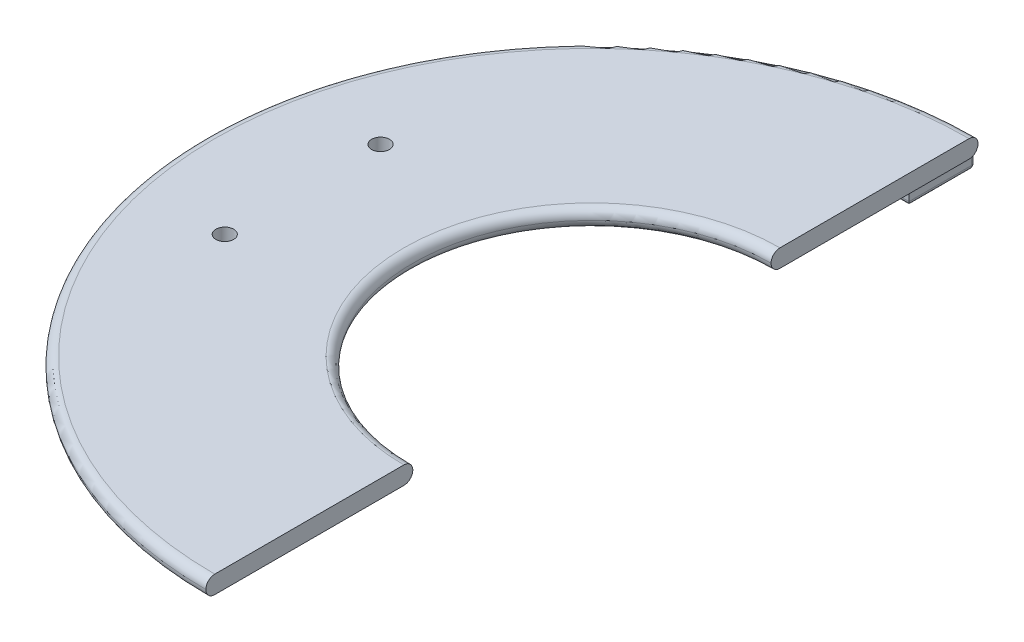
ISO-10303-21;
HEADER;
FILE_DESCRIPTION(('STEP AP214'),'2;1');
FILE_NAME('part.step','',(''),(''),'','','');
FILE_SCHEMA(('AUTOMOTIVE_DESIGN { 1 0 10303 214 1 1 1 1 }'));
ENDSEC;
DATA;
#1=APPLICATION_CONTEXT('core data for automotive mechanical design processes');
#2=APPLICATION_PROTOCOL_DEFINITION('international standard','automotive_design',2000,#1);
#3=PRODUCT_CONTEXT('',#1,'mechanical');
#4=PRODUCT('Part','Part','',(#3));
#5=PRODUCT_RELATED_PRODUCT_CATEGORY('part','',(#4));
#6=PRODUCT_DEFINITION_FORMATION('','',#4);
#7=PRODUCT_DEFINITION_CONTEXT('part definition',#1,'design');
#8=PRODUCT_DEFINITION('design','',#6,#7);
#9=PRODUCT_DEFINITION_SHAPE('','',#8);
#10=(LENGTH_UNIT() NAMED_UNIT(*) SI_UNIT(.MILLI.,.METRE.));
#11=(NAMED_UNIT(*) PLANE_ANGLE_UNIT() SI_UNIT($,.RADIAN.));
#12=(NAMED_UNIT(*) SI_UNIT($,.STERADIAN.) SOLID_ANGLE_UNIT());
#13=UNCERTAINTY_MEASURE_WITH_UNIT(LENGTH_MEASURE(1.E-05),#10,'distance_accuracy_value','');
#14=(GEOMETRIC_REPRESENTATION_CONTEXT(3) GLOBAL_UNCERTAINTY_ASSIGNED_CONTEXT((#13)) GLOBAL_UNIT_ASSIGNED_CONTEXT((#10,
#11,#12)) REPRESENTATION_CONTEXT('',''));
#15=CARTESIAN_POINT('',(0.,0.,0.));
#16=DIRECTION('',(0.,0.,1.));
#17=DIRECTION('',(1.,0.,0.));
#18=AXIS2_PLACEMENT_3D('',#15,#16,#17);
#19=CARTESIAN_POINT('',(-2.49999999999998,-5.,-83.75));
#20=DIRECTION('',(0.,0.,1.));
#21=DIRECTION('',(1.,0.,0.));
#22=AXIS2_PLACEMENT_3D('',#19,#20,#21);
#23=PLANE('',#22);
#24=DIRECTION('',(1.,0.,0.));
#25=VECTOR('',#24,1.);
#26=CARTESIAN_POINT('',(-2.49999999999998,-1.5,-83.75));
#27=LINE('',#26,#25);
#28=CARTESIAN_POINT('',(-13.5,-1.5,-83.75));
#29=VERTEX_POINT('',#28);
#30=CARTESIAN_POINT('',(-3.49999999999998,-1.5,-83.75));
#31=VERTEX_POINT('',#30);
#32=EDGE_CURVE('E190',#29,#31,#27,.T.);
#33=ORIENTED_EDGE('',*,*,#32,.F.);
#34=CARTESIAN_POINT('',(-13.5,-2.5,-83.75));
#35=DIRECTION('',(0.,0.,1.));
#36=DIRECTION('',(1.,0.,0.));
#37=AXIS2_PLACEMENT_3D('',#34,#35,#36);
#38=CIRCLE('',#37,1.);
#39=CARTESIAN_POINT('',(-14.5,-2.5,-83.75));
#40=VERTEX_POINT('',#39);
#41=EDGE_CURVE('E257',#29,#40,#38,.T.);
#42=ORIENTED_EDGE('',*,*,#41,.T.);
#43=DIRECTION('',(0.,1.,0.));
#44=VECTOR('',#43,1.);
#45=CARTESIAN_POINT('',(-14.5,-5.,-83.75));
#46=LINE('',#45,#44);
#47=CARTESIAN_POINT('',(-14.5,0.0151811792350656,-83.75));
#48=VERTEX_POINT('',#47);
#49=EDGE_CURVE('E51',#40,#48,#46,.T.);
#50=ORIENTED_EDGE('',*,*,#49,.T.);
#51=CARTESIAN_POINT('',(-14.5,0.0151811792350658,-83.75));
#52=CARTESIAN_POINT('',(-14.3734136057044,0.0125058415645204,-83.75));
#53=CARTESIAN_POINT('',(-14.2468193154843,0.0102207883173051,-83.75));
#54=CARTESIAN_POINT('',(-13.9936232179031,0.00637405451035215,-83.75));
#55=CARTESIAN_POINT('',(-13.8670214108496,0.00481235380186295,-83.75));
#56=CARTESIAN_POINT('',(-13.6138120039972,0.0023549911208954,-83.75));
#57=CARTESIAN_POINT('',(-13.4872044042234,0.00145932650392246,-83.75));
#58=CARTESIAN_POINT('',(-13.2339827813439,0.000282067447967724,-83.75));
#59=CARTESIAN_POINT('',(-13.1073687581576,4.90112956266747E-07,-83.75));
#60=CARTESIAN_POINT('',(-12.9807549857472,0.,-83.75));
#61=B_SPLINE_CURVE_WITH_KNOTS('',3,(#51,#52,#53,#54,#55,#56,#57,#58,#59,#60),.UNSPECIFIED.,.F.,
.F.,(4,2,2,2,4),(0.,0.379842878170045,0.759675175302849,1.13950596430443,1.51934733247249),.UNSPECIFIED.);
#62=CARTESIAN_POINT('',(-12.9807549857472,0.,-83.75));
#63=VERTEX_POINT('',#62);
#64=EDGE_CURVE('E11',#48,#63,#61,.T.);
#65=ORIENTED_EDGE('',*,*,#64,.T.);
#66=DIRECTION('',(1.,0.,0.));
#67=VECTOR('',#66,1.);
#68=CARTESIAN_POINT('',(-2.49999999999998,0.,-83.75));
#69=LINE('',#68,#67);
#70=CARTESIAN_POINT('',(-2.49999999999998,0.,-83.75));
#71=VERTEX_POINT('',#70);
#72=EDGE_CURVE('E165',#63,#71,#69,.T.);
#73=ORIENTED_EDGE('',*,*,#72,.T.);
#74=DIRECTION('',(0.,1.,0.));
#75=VECTOR('',#74,1.);
#76=CARTESIAN_POINT('',(-2.49999999999998,-5.,-83.75));
#77=LINE('',#76,#75);
#78=CARTESIAN_POINT('',(-2.49999999999998,-2.5,-83.75));
#79=VERTEX_POINT('',#78);
#80=EDGE_CURVE('E168',#79,#71,#77,.T.);
#81=ORIENTED_EDGE('',*,*,#80,.F.);
#82=CARTESIAN_POINT('',(-3.49999999999998,-2.5,-83.75));
#83=DIRECTION('',(0.,0.,1.));
#84=DIRECTION('',(1.,0.,0.));
#85=AXIS2_PLACEMENT_3D('',#82,#83,#84);
#86=CIRCLE('',#85,1.);
#87=EDGE_CURVE('E255',#79,#31,#86,.T.);
#88=ORIENTED_EDGE('',*,*,#87,.T.);
#89=EDGE_LOOP('',(#33,#42,#50,#65,#73,#81,#88));
#90=FACE_BOUND('',#89,.T.);
#91=ADVANCED_FACE('F35',(#90),#23,.F.);
#92=CARTESIAN_POINT('',(0.,0.,0.));
#93=DIRECTION('',(0.,1.,0.));
#94=DIRECTION('',(0.,0.,1.));
#95=AXIS2_PLACEMENT_3D('',#92,#93,#94);
#96=PLANE('',#95);
#97=CARTESIAN_POINT('',(-65.,0.,17.5));
#98=DIRECTION('',(0.,1.,0.));
#99=DIRECTION('',(0.,0.,1.));
#100=AXIS2_PLACEMENT_3D('',#97,#98,#99);
#101=CIRCLE('',#100,2.);
#102=CARTESIAN_POINT('',(-65.,0.,19.5));
#103=VERTEX_POINT('',#102);
#104=EDGE_CURVE('E39',#103,#103,#101,.T.);
#105=ORIENTED_EDGE('',*,*,#104,.T.);
#106=EDGE_LOOP('',(#105));
#107=FACE_BOUND('',#106,.T.);
#108=CARTESIAN_POINT('',(-65.,0.,-17.5));
#109=DIRECTION('',(0.,1.,0.));
#110=DIRECTION('',(0.,0.,1.));
#111=AXIS2_PLACEMENT_3D('',#108,#109,#110);
#112=CIRCLE('',#111,2.);
#113=CARTESIAN_POINT('',(-65.,0.,-15.5));
#114=VERTEX_POINT('',#113);
#115=EDGE_CURVE('E462',#114,#114,#112,.T.);
#116=ORIENTED_EDGE('',*,*,#115,.T.);
#117=EDGE_LOOP('',(#116));
#118=FACE_BOUND('',#117,.T.);
#119=DIRECTION('',(0.,0.,-1.));
#120=VECTOR('',#119,1.);
#121=CARTESIAN_POINT('',(0.,0.,-86.75));
#122=LINE('',#121,#120);
#123=CARTESIAN_POINT('',(0.,0.,-42.25));
#124=VERTEX_POINT('',#123);
#125=CARTESIAN_POINT('',(0.,0.,-84.75));
#126=VERTEX_POINT('',#125);
#127=EDGE_CURVE('E205',#124,#126,#122,.T.);
#128=ORIENTED_EDGE('',*,*,#127,.F.);
#129=CARTESIAN_POINT('',(0.,0.,0.));
#130=DIRECTION('',(0.,1.,0.));
#131=DIRECTION('',(0.,0.,1.));
#132=AXIS2_PLACEMENT_3D('',#129,#130,#131);
#133=CIRCLE('',#132,42.25);
#134=CARTESIAN_POINT('',(0.,0.,42.25));
#135=VERTEX_POINT('',#134);
#136=EDGE_CURVE('E323',#124,#135,#133,.T.);
#137=ORIENTED_EDGE('',*,*,#136,.T.);
#138=DIRECTION('',(0.,0.,-1.));
#139=VECTOR('',#138,1.);
#140=CARTESIAN_POINT('',(0.,0.,40.25));
#141=LINE('',#140,#139);
#142=CARTESIAN_POINT('',(0.,0.,84.75));
#143=VERTEX_POINT('',#142);
#144=EDGE_CURVE('E210',#143,#135,#141,.T.);
#145=ORIENTED_EDGE('',*,*,#144,.F.);
#146=CARTESIAN_POINT('',(0.,0.,0.));
#147=DIRECTION('',(0.,1.,0.));
#148=DIRECTION('',(0.,0.,1.));
#149=AXIS2_PLACEMENT_3D('',#146,#147,#148);
#150=CIRCLE('',#149,84.75);
#151=CARTESIAN_POINT('',(-14.5,0.,-83.5003742506583));
#152=VERTEX_POINT('',#151);
#153=EDGE_CURVE('E321',#143,#152,#150,.F.);
#154=ORIENTED_EDGE('',*,*,#153,.T.);
#155=DIRECTION('',(0.,0.,-1.));
#156=VECTOR('',#155,1.);
#157=CARTESIAN_POINT('',(-14.5,0.,-83.75));
#158=LINE('',#157,#156);
#159=CARTESIAN_POINT('',(-14.5,0.,-73.75));
#160=VERTEX_POINT('',#159);
#161=EDGE_CURVE('E173',#160,#152,#158,.T.);
#162=ORIENTED_EDGE('',*,*,#161,.F.);
#163=DIRECTION('',(-1.,0.,0.));
#164=VECTOR('',#163,1.);
#165=CARTESIAN_POINT('',(-2.49999999999999,0.,-73.75));
#166=LINE('',#165,#164);
#167=CARTESIAN_POINT('',(-2.49999999999999,0.,-73.75));
#168=VERTEX_POINT('',#167);
#169=EDGE_CURVE('E189',#168,#160,#166,.T.);
#170=ORIENTED_EDGE('',*,*,#169,.F.);
#171=DIRECTION('',(0.,0.,1.));
#172=VECTOR('',#171,1.);
#173=CARTESIAN_POINT('',(-2.49999999999998,0.,-83.75));
#174=LINE('',#173,#172);
#175=EDGE_CURVE('E179',#71,#168,#174,.T.);
#176=ORIENTED_EDGE('',*,*,#175,.F.);
#177=ORIENTED_EDGE('',*,*,#72,.F.);
#178=CARTESIAN_POINT('',(0.,0.,0.));
#179=DIRECTION('',(0.,1.,0.));
#180=DIRECTION('',(0.,0.,1.));
#181=AXIS2_PLACEMENT_3D('',#178,#179,#180);
#182=CIRCLE('',#181,84.75);
#183=EDGE_CURVE('E319',#63,#126,#182,.F.);
#184=ORIENTED_EDGE('',*,*,#183,.T.);
#185=EDGE_LOOP('',(#128,#137,#145,#154,#162,#170,#176,#177,#184));
#186=FACE_BOUND('',#185,.T.);
#187=ADVANCED_FACE('F186',(#107,#118,#186),#96,.F.);
#188=CARTESIAN_POINT('',(0.,4.,-86.75));
#189=DIRECTION('',(-1.,0.,0.));
#190=DIRECTION('',(0.,0.,1.));
#191=AXIS2_PLACEMENT_3D('',#188,#189,#190);
#192=PLANE('',#191);
#193=DIRECTION('',(0.,0.,-1.));
#194=VECTOR('',#193,1.);
#195=CARTESIAN_POINT('',(0.,4.,-86.75));
#196=LINE('',#195,#194);
#197=CARTESIAN_POINT('',(0.,4.,-42.25));
#198=VERTEX_POINT('',#197);
#199=CARTESIAN_POINT('',(0.,4.,-84.75));
#200=VERTEX_POINT('',#199);
#201=EDGE_CURVE('E206',#198,#200,#196,.T.);
#202=ORIENTED_EDGE('',*,*,#201,.F.);
#203=CARTESIAN_POINT('',(0.,2.,-42.25));
#204=DIRECTION('',(-1.,0.,0.));
#205=DIRECTION('',(0.,0.,1.));
#206=AXIS2_PLACEMENT_3D('',#203,#204,#205);
#207=CIRCLE('',#206,2.);
#208=CARTESIAN_POINT('',(0.,2.,-40.25));
#209=VERTEX_POINT('',#208);
#210=EDGE_CURVE('E309',#198,#209,#207,.F.);
#211=ORIENTED_EDGE('',*,*,#210,.T.);
#212=CARTESIAN_POINT('',(0.,2.,-42.25));
#213=DIRECTION('',(-1.,0.,0.));
#214=DIRECTION('',(0.,0.,1.));
#215=AXIS2_PLACEMENT_3D('',#212,#213,#214);
#216=CIRCLE('',#215,2.);
#217=EDGE_CURVE('E307',#209,#124,#216,.F.);
#218=ORIENTED_EDGE('',*,*,#217,.T.);
#219=ORIENTED_EDGE('',*,*,#127,.T.);
#220=CARTESIAN_POINT('',(0.,2.,-84.75));
#221=DIRECTION('',(-1.,0.,0.));
#222=DIRECTION('',(0.,0.,1.));
#223=AXIS2_PLACEMENT_3D('',#220,#221,#222);
#224=CIRCLE('',#223,2.);
#225=CARTESIAN_POINT('',(0.,2.,-86.75));
#226=VERTEX_POINT('',#225);
#227=EDGE_CURVE('E305',#126,#226,#224,.F.);
#228=ORIENTED_EDGE('',*,*,#227,.T.);
#229=CARTESIAN_POINT('',(0.,2.,-84.75));
#230=DIRECTION('',(-1.,0.,0.));
#231=DIRECTION('',(0.,0.,1.));
#232=AXIS2_PLACEMENT_3D('',#229,#230,#231);
#233=CIRCLE('',#232,2.);
#234=EDGE_CURVE('E303',#226,#200,#233,.F.);
#235=ORIENTED_EDGE('',*,*,#234,.T.);
#236=EDGE_LOOP('',(#202,#211,#218,#219,#228,#235));
#237=FACE_BOUND('',#236,.T.);
#238=ADVANCED_FACE('F406',(#237),#192,.F.);
#239=CARTESIAN_POINT('',(0.,4.,40.25));
#240=DIRECTION('',(-1.,0.,0.));
#241=DIRECTION('',(0.,0.,1.));
#242=AXIS2_PLACEMENT_3D('',#239,#240,#241);
#243=PLANE('',#242);
#244=CARTESIAN_POINT('',(0.,2.,42.25));
#245=DIRECTION('',(-1.,0.,0.));
#246=DIRECTION('',(0.,0.,1.));
#247=AXIS2_PLACEMENT_3D('',#244,#245,#246);
#248=CIRCLE('',#247,2.);
#249=CARTESIAN_POINT('',(0.,2.,40.25));
#250=VERTEX_POINT('',#249);
#251=EDGE_CURVE('E315',#135,#250,#248,.F.);
#252=ORIENTED_EDGE('',*,*,#251,.T.);
#253=CARTESIAN_POINT('',(0.,2.,42.25));
#254=DIRECTION('',(-1.,0.,0.));
#255=DIRECTION('',(0.,0.,1.));
#256=AXIS2_PLACEMENT_3D('',#253,#254,#255);
#257=CIRCLE('',#256,2.);
#258=CARTESIAN_POINT('',(0.,4.,42.25));
#259=VERTEX_POINT('',#258);
#260=EDGE_CURVE('E317',#250,#259,#257,.F.);
#261=ORIENTED_EDGE('',*,*,#260,.T.);
#262=DIRECTION('',(0.,0.,-1.));
#263=VECTOR('',#262,1.);
#264=CARTESIAN_POINT('',(0.,4.,40.25));
#265=LINE('',#264,#263);
#266=CARTESIAN_POINT('',(0.,4.,84.75));
#267=VERTEX_POINT('',#266);
#268=EDGE_CURVE('E209',#267,#259,#265,.T.);
#269=ORIENTED_EDGE('',*,*,#268,.F.);
#270=CARTESIAN_POINT('',(0.,2.,84.75));
#271=DIRECTION('',(-1.,0.,0.));
#272=DIRECTION('',(0.,0.,1.));
#273=AXIS2_PLACEMENT_3D('',#270,#271,#272);
#274=CIRCLE('',#273,2.);
#275=CARTESIAN_POINT('',(0.,2.,86.75));
#276=VERTEX_POINT('',#275);
#277=EDGE_CURVE('E311',#267,#276,#274,.F.);
#278=ORIENTED_EDGE('',*,*,#277,.T.);
#279=CARTESIAN_POINT('',(0.,2.,84.75));
#280=DIRECTION('',(-1.,0.,0.));
#281=DIRECTION('',(0.,0.,1.));
#282=AXIS2_PLACEMENT_3D('',#279,#280,#281);
#283=CIRCLE('',#282,2.);
#284=EDGE_CURVE('E313',#276,#143,#283,.F.);
#285=ORIENTED_EDGE('',*,*,#284,.T.);
#286=ORIENTED_EDGE('',*,*,#144,.T.);
#287=EDGE_LOOP('',(#252,#261,#269,#278,#285,#286));
#288=FACE_BOUND('',#287,.T.);
#289=ADVANCED_FACE('F409',(#288),#243,.F.);
#290=CARTESIAN_POINT('',(0.,4.,0.));
#291=DIRECTION('',(0.,1.,0.));
#292=DIRECTION('',(0.,0.,1.));
#293=AXIS2_PLACEMENT_3D('',#290,#291,#292);
#294=PLANE('',#293);
#295=CARTESIAN_POINT('',(-65.,4.,17.5));
#296=DIRECTION('',(0.,1.,0.));
#297=DIRECTION('',(0.,0.,1.));
#298=AXIS2_PLACEMENT_3D('',#295,#296,#297);
#299=CIRCLE('',#298,2.);
#300=CARTESIAN_POINT('',(-65.,4.,19.5));
#301=VERTEX_POINT('',#300);
#302=EDGE_CURVE('E457',#301,#301,#299,.T.);
#303=ORIENTED_EDGE('',*,*,#302,.F.);
#304=EDGE_LOOP('',(#303));
#305=FACE_BOUND('',#304,.T.);
#306=CARTESIAN_POINT('',(-65.,4.,-17.5));
#307=DIRECTION('',(0.,1.,0.));
#308=DIRECTION('',(0.,0.,1.));
#309=AXIS2_PLACEMENT_3D('',#306,#307,#308);
#310=CIRCLE('',#309,2.);
#311=CARTESIAN_POINT('',(-65.,4.,-15.5));
#312=VERTEX_POINT('',#311);
#313=EDGE_CURVE('E460',#312,#312,#310,.T.);
#314=ORIENTED_EDGE('',*,*,#313,.F.);
#315=EDGE_LOOP('',(#314));
#316=FACE_BOUND('',#315,.T.);
#317=ORIENTED_EDGE('',*,*,#268,.T.);
#318=CARTESIAN_POINT('',(0.,4.,0.));
#319=DIRECTION('',(0.,1.,0.));
#320=DIRECTION('',(0.,0.,1.));
#321=AXIS2_PLACEMENT_3D('',#318,#319,#320);
#322=CIRCLE('',#321,42.25);
#323=EDGE_CURVE('E300',#259,#198,#322,.F.);
#324=ORIENTED_EDGE('',*,*,#323,.T.);
#325=ORIENTED_EDGE('',*,*,#201,.T.);
#326=CARTESIAN_POINT('',(0.,4.,0.));
#327=DIRECTION('',(0.,1.,0.));
#328=DIRECTION('',(0.,0.,1.));
#329=AXIS2_PLACEMENT_3D('',#326,#327,#328);
#330=CIRCLE('',#329,84.75);
#331=EDGE_CURVE('E259',#200,#267,#330,.T.);
#332=ORIENTED_EDGE('',*,*,#331,.T.);
#333=EDGE_LOOP('',(#317,#324,#325,#332));
#334=FACE_BOUND('',#333,.T.);
#335=ADVANCED_FACE('F413',(#305,#316,#334),#294,.T.);
#336=CARTESIAN_POINT('',(-2.49999999999998,-5.,-83.75));
#337=DIRECTION('',(-1.,0.,0.));
#338=DIRECTION('',(0.,0.,1.));
#339=AXIS2_PLACEMENT_3D('',#336,#337,#338);
#340=PLANE('',#339);
#341=DIRECTION('',(0.,0.,1.));
#342=VECTOR('',#341,1.);
#343=CARTESIAN_POINT('',(-2.49999999999998,-2.5,-83.75));
#344=LINE('',#343,#342);
#345=CARTESIAN_POINT('',(-2.49999999999998,-2.5,-87.75));
#346=VERTEX_POINT('',#345);
#347=EDGE_CURVE('E181',#346,#79,#344,.T.);
#348=ORIENTED_EDGE('',*,*,#347,.T.);
#349=ORIENTED_EDGE('',*,*,#80,.T.);
#350=ORIENTED_EDGE('',*,*,#175,.T.);
#351=DIRECTION('',(0.,1.,0.));
#352=VECTOR('',#351,1.);
#353=CARTESIAN_POINT('',(-2.49999999999999,-5.,-73.75));
#354=LINE('',#353,#352);
#355=CARTESIAN_POINT('',(-2.49999999999999,-4.,-73.75));
#356=VERTEX_POINT('',#355);
#357=EDGE_CURVE('E203',#356,#168,#354,.T.);
#358=ORIENTED_EDGE('',*,*,#357,.F.);
#359=DIRECTION('',(0.,0.,1.));
#360=VECTOR('',#359,1.);
#361=CARTESIAN_POINT('',(-2.49999999999998,-4.,-88.75));
#362=LINE('',#361,#360);
#363=CARTESIAN_POINT('',(-2.49999999999998,-4.,-87.75));
#364=VERTEX_POINT('',#363);
#365=EDGE_CURVE('E229',#356,#364,#362,.F.);
#366=ORIENTED_EDGE('',*,*,#365,.T.);
#367=DIRECTION('',(0.,-1.,0.));
#368=VECTOR('',#367,1.);
#369=CARTESIAN_POINT('',(-2.49999999999998,-5.,-87.75));
#370=LINE('',#369,#368);
#371=EDGE_CURVE('E226',#364,#346,#370,.F.);
#372=ORIENTED_EDGE('',*,*,#371,.T.);
#373=EDGE_LOOP('',(#348,#349,#350,#358,#366,#372));
#374=FACE_BOUND('',#373,.T.);
#375=ADVANCED_FACE('F177',(#374),#340,.F.);
#376=CARTESIAN_POINT('',(-2.49999999999999,-5.,-73.75));
#377=DIRECTION('',(0.,0.,-1.));
#378=DIRECTION('',(-1.,0.,0.));
#379=AXIS2_PLACEMENT_3D('',#376,#377,#378);
#380=PLANE('',#379);
#381=DIRECTION('',(0.,1.,0.));
#382=VECTOR('',#381,1.);
#383=CARTESIAN_POINT('',(-14.5,-5.,-73.75));
#384=LINE('',#383,#382);
#385=CARTESIAN_POINT('',(-14.5,-4.,-73.75));
#386=VERTEX_POINT('',#385);
#387=EDGE_CURVE('E201',#386,#160,#384,.T.);
#388=ORIENTED_EDGE('',*,*,#387,.F.);
#389=DIRECTION('',(-1.,0.,0.));
#390=VECTOR('',#389,1.);
#391=CARTESIAN_POINT('',(-2.49999999999999,-4.,-73.75));
#392=LINE('',#391,#390);
#393=EDGE_CURVE('E244',#386,#356,#392,.F.);
#394=ORIENTED_EDGE('',*,*,#393,.T.);
#395=ORIENTED_EDGE('',*,*,#357,.T.);
#396=ORIENTED_EDGE('',*,*,#169,.T.);
#397=EDGE_LOOP('',(#388,#394,#395,#396));
#398=FACE_BOUND('',#397,.T.);
#399=ADVANCED_FACE('F422',(#398),#380,.F.);
#400=CARTESIAN_POINT('',(-14.5,-5.,-83.75));
#401=DIRECTION('',(1.,0.,0.));
#402=DIRECTION('',(0.,0.,-1.));
#403=AXIS2_PLACEMENT_3D('',#400,#401,#402);
#404=PLANE('',#403);
#405=DIRECTION('',(0.,1.,0.));
#406=VECTOR('',#405,1.);
#407=CARTESIAN_POINT('',(-14.5,-5.,-87.75));
#408=LINE('',#407,#406);
#409=CARTESIAN_POINT('',(-14.5,-2.5,-87.75));
#410=VERTEX_POINT('',#409);
#411=CARTESIAN_POINT('',(-14.5,-4.,-87.75));
#412=VERTEX_POINT('',#411);
#413=EDGE_CURVE('E232',#410,#412,#408,.F.);
#414=ORIENTED_EDGE('',*,*,#413,.T.);
#415=DIRECTION('',(0.,0.,-1.));
#416=VECTOR('',#415,1.);
#417=CARTESIAN_POINT('',(-14.5,-4.,-73.75));
#418=LINE('',#417,#416);
#419=EDGE_CURVE('E236',#412,#386,#418,.F.);
#420=ORIENTED_EDGE('',*,*,#419,.T.);
#421=ORIENTED_EDGE('',*,*,#387,.T.);
#422=ORIENTED_EDGE('',*,*,#161,.T.);
#423=CARTESIAN_POINT('',(-14.5,0.,-83.5003742506583));
#424=CARTESIAN_POINT('',(-14.5,2.01541857068038E-06,-83.5421322937936));
#425=CARTESIAN_POINT('',(-14.5,0.0012681212962649,-83.5838134603106));
#426=CARTESIAN_POINT('',(-14.5,0.00632851417234035,-83.6670220434368));
#427=CARTESIAN_POINT('',(-14.5,0.0101228013730003,-83.7085494600337));
#428=CARTESIAN_POINT('',(-14.5,0.0151811792350624,-83.75));
#429=B_SPLINE_CURVE_WITH_KNOTS('',3,(#423,#424,#425,#426,#427,#428),.UNSPECIFIED.,.F.,.F.,(4,2,
4),(0.,0.125101175041672,0.250202360092635),.UNSPECIFIED.);
#430=EDGE_CURVE('E44',#152,#48,#429,.T.);
#431=ORIENTED_EDGE('',*,*,#430,.T.);
#432=ORIENTED_EDGE('',*,*,#49,.F.);
#433=DIRECTION('',(0.,0.,1.));
#434=VECTOR('',#433,1.);
#435=CARTESIAN_POINT('',(-14.5,-2.5,-83.75));
#436=LINE('',#435,#434);
#437=EDGE_CURVE('E234',#40,#410,#436,.F.);
#438=ORIENTED_EDGE('',*,*,#437,.T.);
#439=EDGE_LOOP('',(#414,#420,#421,#422,#431,#432,#438));
#440=FACE_BOUND('',#439,.T.);
#441=ADVANCED_FACE('F336',(#440),#404,.F.);
#442=CARTESIAN_POINT('',(0.,-5.,0.));
#443=DIRECTION('',(0.,-1.,0.));
#444=DIRECTION('',(0.,0.,-1.));
#445=AXIS2_PLACEMENT_3D('',#442,#443,#444);
#446=PLANE('',#445);
#447=DIRECTION('',(0.,0.,1.));
#448=VECTOR('',#447,1.);
#449=CARTESIAN_POINT('',(-3.49999999999999,-5.,-73.75));
#450=LINE('',#449,#448);
#451=CARTESIAN_POINT('',(-3.49999999999998,-5.,-87.75));
#452=VERTEX_POINT('',#451);
#453=CARTESIAN_POINT('',(-3.49999999999999,-5.,-74.75));
#454=VERTEX_POINT('',#453);
#455=EDGE_CURVE('E221',#452,#454,#450,.T.);
#456=ORIENTED_EDGE('',*,*,#455,.T.);
#457=DIRECTION('',(-1.,0.,0.));
#458=VECTOR('',#457,1.);
#459=CARTESIAN_POINT('',(-14.5,-5.,-74.75));
#460=LINE('',#459,#458);
#461=CARTESIAN_POINT('',(-13.5,-5.,-74.75));
#462=VERTEX_POINT('',#461);
#463=EDGE_CURVE('E224',#454,#462,#460,.T.);
#464=ORIENTED_EDGE('',*,*,#463,.T.);
#465=DIRECTION('',(0.,0.,-1.));
#466=VECTOR('',#465,1.);
#467=CARTESIAN_POINT('',(-13.5,-5.,-88.75));
#468=LINE('',#467,#466);
#469=CARTESIAN_POINT('',(-13.5,-5.,-87.75));
#470=VERTEX_POINT('',#469);
#471=EDGE_CURVE('E219',#462,#470,#468,.T.);
#472=ORIENTED_EDGE('',*,*,#471,.T.);
#473=DIRECTION('',(-1.,0.,0.));
#474=VECTOR('',#473,1.);
#475=CARTESIAN_POINT('',(-2.49999999999998,-5.,-87.75));
#476=LINE('',#475,#474);
#477=EDGE_CURVE('E213',#470,#452,#476,.F.);
#478=ORIENTED_EDGE('',*,*,#477,.T.);
#479=EDGE_LOOP('',(#456,#464,#472,#478));
#480=FACE_BOUND('',#479,.T.);
#481=ADVANCED_FACE('F428',(#480),#446,.T.);
#482=CARTESIAN_POINT('',(-2.49999999999998,-1.5,-88.75));
#483=DIRECTION('',(0.,-1.,0.));
#484=DIRECTION('',(0.,0.,-1.));
#485=AXIS2_PLACEMENT_3D('',#482,#483,#484);
#486=PLANE('',#485);
#487=ORIENTED_EDGE('',*,*,#32,.T.);
#488=DIRECTION('',(0.,0.,1.));
#489=VECTOR('',#488,1.);
#490=CARTESIAN_POINT('',(-3.49999999999998,-1.5,-88.75));
#491=LINE('',#490,#489);
#492=CARTESIAN_POINT('',(-3.49999999999998,-1.5,-87.75));
#493=VERTEX_POINT('',#492);
#494=EDGE_CURVE('E242',#31,#493,#491,.F.);
#495=ORIENTED_EDGE('',*,*,#494,.T.);
#496=DIRECTION('',(1.,0.,0.));
#497=VECTOR('',#496,1.);
#498=CARTESIAN_POINT('',(-2.49999999999998,-1.5,-87.75));
#499=LINE('',#498,#497);
#500=CARTESIAN_POINT('',(-13.5,-1.5,-87.75));
#501=VERTEX_POINT('',#500);
#502=EDGE_CURVE('E238',#493,#501,#499,.F.);
#503=ORIENTED_EDGE('',*,*,#502,.T.);
#504=DIRECTION('',(0.,0.,1.));
#505=VECTOR('',#504,1.);
#506=CARTESIAN_POINT('',(-13.5,-1.5,-88.75));
#507=LINE('',#506,#505);
#508=EDGE_CURVE('E240',#501,#29,#507,.T.);
#509=ORIENTED_EDGE('',*,*,#508,.T.);
#510=EDGE_LOOP('',(#487,#495,#503,#509));
#511=FACE_BOUND('',#510,.T.);
#512=ADVANCED_FACE('F438',(#511),#486,.F.);
#513=CARTESIAN_POINT('',(0.,0.,-88.75));
#514=DIRECTION('',(0.,0.,1.));
#515=DIRECTION('',(1.,0.,0.));
#516=AXIS2_PLACEMENT_3D('',#513,#514,#515);
#517=PLANE('',#516);
#518=DIRECTION('',(1.,0.,0.));
#519=VECTOR('',#518,1.);
#520=CARTESIAN_POINT('',(0.,-2.5,-88.75));
#521=LINE('',#520,#519);
#522=CARTESIAN_POINT('',(-13.5,-2.5,-88.75));
#523=VERTEX_POINT('',#522);
#524=CARTESIAN_POINT('',(-3.49999999999998,-2.5,-88.75));
#525=VERTEX_POINT('',#524);
#526=EDGE_CURVE('E248',#523,#525,#521,.T.);
#527=ORIENTED_EDGE('',*,*,#526,.T.);
#528=DIRECTION('',(0.,-1.,0.));
#529=VECTOR('',#528,1.);
#530=CARTESIAN_POINT('',(-3.49999999999998,0.,-88.75));
#531=LINE('',#530,#529);
#532=CARTESIAN_POINT('',(-3.49999999999998,-4.,-88.75));
#533=VERTEX_POINT('',#532);
#534=EDGE_CURVE('E253',#525,#533,#531,.T.);
#535=ORIENTED_EDGE('',*,*,#534,.T.);
#536=DIRECTION('',(-1.,0.,0.));
#537=VECTOR('',#536,1.);
#538=CARTESIAN_POINT('',(-14.5,-4.,-88.75));
#539=LINE('',#538,#537);
#540=CARTESIAN_POINT('',(-13.5,-4.,-88.75));
#541=VERTEX_POINT('',#540);
#542=EDGE_CURVE('E250',#533,#541,#539,.T.);
#543=ORIENTED_EDGE('',*,*,#542,.T.);
#544=DIRECTION('',(0.,1.,0.));
#545=VECTOR('',#544,1.);
#546=CARTESIAN_POINT('',(-13.5,0.,-88.75));
#547=LINE('',#546,#545);
#548=EDGE_CURVE('E246',#541,#523,#547,.T.);
#549=ORIENTED_EDGE('',*,*,#548,.T.);
#550=EDGE_LOOP('',(#527,#535,#543,#549));
#551=FACE_BOUND('',#550,.T.);
#552=ADVANCED_FACE('F358',(#551),#517,.F.);
#553=CARTESIAN_POINT('',(-13.5,-2.5,-88.75));
#554=DIRECTION('',(0.,0.,1.));
#555=DIRECTION('',(1.,0.,0.));
#556=AXIS2_PLACEMENT_3D('',#553,#554,#555);
#557=CYLINDRICAL_SURFACE('',#556,1.);
#558=CARTESIAN_POINT('',(-13.5,-2.5,-87.75));
#559=DIRECTION('',(0.,0.,-1.));
#560=DIRECTION('',(-1.,0.,0.));
#561=AXIS2_PLACEMENT_3D('',#558,#559,#560);
#562=CIRCLE('',#561,1.);
#563=EDGE_CURVE('E194',#410,#501,#562,.T.);
#564=ORIENTED_EDGE('',*,*,#563,.F.);
#565=ORIENTED_EDGE('',*,*,#437,.F.);
#566=ORIENTED_EDGE('',*,*,#41,.F.);
#567=ORIENTED_EDGE('',*,*,#508,.F.);
#568=EDGE_LOOP('',(#564,#565,#566,#567));
#569=FACE_BOUND('',#568,.T.);
#570=ADVANCED_FACE('F354',(#569),#557,.T.);
#571=CARTESIAN_POINT('',(-13.5,-2.5,-87.75));
#572=DIRECTION('',(0.,0.,1.));
#573=DIRECTION('',(1.,0.,0.));
#574=AXIS2_PLACEMENT_3D('',#571,#572,#573);
#575=SPHERICAL_SURFACE('',#574,1.);
#576=CARTESIAN_POINT('',(-13.5,-2.5,-87.75));
#577=DIRECTION('',(0.,1.,0.));
#578=DIRECTION('',(0.,0.,1.));
#579=AXIS2_PLACEMENT_3D('',#576,#577,#578);
#580=CIRCLE('',#579,1.);
#581=EDGE_CURVE('E291',#410,#523,#580,.F.);
#582=ORIENTED_EDGE('',*,*,#581,.F.);
#583=ORIENTED_EDGE('',*,*,#563,.T.);
#584=CARTESIAN_POINT('',(-13.5,-2.5,-87.75));
#585=DIRECTION('',(-1.,0.,0.));
#586=DIRECTION('',(0.,0.,1.));
#587=AXIS2_PLACEMENT_3D('',#584,#585,#586);
#588=CIRCLE('',#587,1.);
#589=EDGE_CURVE('E294',#523,#501,#588,.F.);
#590=ORIENTED_EDGE('',*,*,#589,.F.);
#591=EDGE_LOOP('',(#582,#583,#590));
#592=FACE_BOUND('',#591,.T.);
#593=ADVANCED_FACE('F357',(#592),#575,.T.);
#594=CARTESIAN_POINT('',(-3.49999999999998,-2.5,-83.75));
#595=DIRECTION('',(0.,0.,1.));
#596=DIRECTION('',(1.,0.,0.));
#597=AXIS2_PLACEMENT_3D('',#594,#595,#596);
#598=CYLINDRICAL_SURFACE('',#597,1.);
#599=ORIENTED_EDGE('',*,*,#87,.F.);
#600=ORIENTED_EDGE('',*,*,#347,.F.);
#601=CARTESIAN_POINT('',(-3.49999999999998,-2.5,-87.75));
#602=DIRECTION('',(0.,0.,-1.));
#603=DIRECTION('',(-1.,0.,0.));
#604=AXIS2_PLACEMENT_3D('',#601,#602,#603);
#605=CIRCLE('',#604,1.);
#606=EDGE_CURVE('E288',#493,#346,#605,.T.);
#607=ORIENTED_EDGE('',*,*,#606,.F.);
#608=ORIENTED_EDGE('',*,*,#494,.F.);
#609=EDGE_LOOP('',(#599,#600,#607,#608));
#610=FACE_BOUND('',#609,.T.);
#611=ADVANCED_FACE('F362',(#610),#598,.T.);
#612=CARTESIAN_POINT('',(0.,-2.5,-87.75));
#613=DIRECTION('',(1.,0.,0.));
#614=DIRECTION('',(0.,0.,-1.));
#615=AXIS2_PLACEMENT_3D('',#612,#613,#614);
#616=CYLINDRICAL_SURFACE('',#615,1.);
#617=ORIENTED_EDGE('',*,*,#589,.T.);
#618=ORIENTED_EDGE('',*,*,#502,.F.);
#619=CARTESIAN_POINT('',(-3.49999999999998,-2.5,-87.75));
#620=DIRECTION('',(1.,0.,0.));
#621=DIRECTION('',(0.,0.,-1.));
#622=AXIS2_PLACEMENT_3D('',#619,#620,#621);
#623=CIRCLE('',#622,1.);
#624=EDGE_CURVE('E285',#525,#493,#623,.T.);
#625=ORIENTED_EDGE('',*,*,#624,.F.);
#626=ORIENTED_EDGE('',*,*,#526,.F.);
#627=EDGE_LOOP('',(#617,#618,#625,#626));
#628=FACE_BOUND('',#627,.T.);
#629=ADVANCED_FACE('F366',(#628),#616,.T.);
#630=CARTESIAN_POINT('',(-13.5,0.,-87.75));
#631=DIRECTION('',(0.,1.,0.));
#632=DIRECTION('',(0.,0.,1.));
#633=AXIS2_PLACEMENT_3D('',#630,#631,#632);
#634=CYLINDRICAL_SURFACE('',#633,1.);
#635=ORIENTED_EDGE('',*,*,#581,.T.);
#636=ORIENTED_EDGE('',*,*,#548,.F.);
#637=CARTESIAN_POINT('',(-13.5,-4.,-87.75));
#638=DIRECTION('',(0.,-1.,0.));
#639=DIRECTION('',(0.,0.,-1.));
#640=AXIS2_PLACEMENT_3D('',#637,#638,#639);
#641=CIRCLE('',#640,1.);
#642=EDGE_CURVE('E282',#412,#541,#641,.T.);
#643=ORIENTED_EDGE('',*,*,#642,.F.);
#644=ORIENTED_EDGE('',*,*,#413,.F.);
#645=EDGE_LOOP('',(#635,#636,#643,#644));
#646=FACE_BOUND('',#645,.T.);
#647=ADVANCED_FACE('F370',(#646),#634,.T.);
#648=CARTESIAN_POINT('',(-3.49999999999998,-2.5,-87.75));
#649=DIRECTION('',(0.,0.,1.));
#650=DIRECTION('',(1.,0.,0.));
#651=AXIS2_PLACEMENT_3D('',#648,#649,#650);
#652=SPHERICAL_SURFACE('',#651,1.);
#653=ORIENTED_EDGE('',*,*,#624,.T.);
#654=ORIENTED_EDGE('',*,*,#606,.T.);
#655=CARTESIAN_POINT('',(-3.49999999999998,-2.5,-87.75));
#656=DIRECTION('',(0.,1.,0.));
#657=DIRECTION('',(0.,0.,1.));
#658=AXIS2_PLACEMENT_3D('',#655,#656,#657);
#659=CIRCLE('',#658,1.);
#660=EDGE_CURVE('E279',#525,#346,#659,.F.);
#661=ORIENTED_EDGE('',*,*,#660,.F.);
#662=EDGE_LOOP('',(#653,#654,#661));
#663=FACE_BOUND('',#662,.T.);
#664=ADVANCED_FACE('F374',(#663),#652,.T.);
#665=CARTESIAN_POINT('',(-13.5,-4.,-87.75));
#666=DIRECTION('',(0.,0.,1.));
#667=DIRECTION('',(1.,0.,0.));
#668=AXIS2_PLACEMENT_3D('',#665,#666,#667);
#669=SPHERICAL_SURFACE('',#668,1.);
#670=CARTESIAN_POINT('',(-13.5,-4.,-87.75));
#671=DIRECTION('',(0.,0.,-1.));
#672=DIRECTION('',(-1.,0.,0.));
#673=AXIS2_PLACEMENT_3D('',#670,#671,#672);
#674=CIRCLE('',#673,1.);
#675=EDGE_CURVE('E274',#412,#470,#674,.F.);
#676=ORIENTED_EDGE('',*,*,#675,.F.);
#677=ORIENTED_EDGE('',*,*,#642,.T.);
#678=CARTESIAN_POINT('',(-13.5,-4.,-87.75));
#679=DIRECTION('',(-1.,0.,0.));
#680=DIRECTION('',(0.,0.,1.));
#681=AXIS2_PLACEMENT_3D('',#678,#679,#680);
#682=CIRCLE('',#681,1.);
#683=EDGE_CURVE('E277',#470,#541,#682,.F.);
#684=ORIENTED_EDGE('',*,*,#683,.F.);
#685=EDGE_LOOP('',(#676,#677,#684));
#686=FACE_BOUND('',#685,.T.);
#687=ADVANCED_FACE('F378',(#686),#669,.T.);
#688=CARTESIAN_POINT('',(-3.49999999999998,0.,-87.75));
#689=DIRECTION('',(0.,-1.,0.));
#690=DIRECTION('',(0.,0.,-1.));
#691=AXIS2_PLACEMENT_3D('',#688,#689,#690);
#692=CYLINDRICAL_SURFACE('',#691,1.);
#693=ORIENTED_EDGE('',*,*,#660,.T.);
#694=ORIENTED_EDGE('',*,*,#371,.F.);
#695=CARTESIAN_POINT('',(-3.49999999999998,-4.,-87.75));
#696=DIRECTION('',(0.,-1.,0.));
#697=DIRECTION('',(0.,0.,-1.));
#698=AXIS2_PLACEMENT_3D('',#695,#696,#697);
#699=CIRCLE('',#698,1.);
#700=EDGE_CURVE('E271',#533,#364,#699,.T.);
#701=ORIENTED_EDGE('',*,*,#700,.F.);
#702=ORIENTED_EDGE('',*,*,#534,.F.);
#703=EDGE_LOOP('',(#693,#694,#701,#702));
#704=FACE_BOUND('',#703,.T.);
#705=ADVANCED_FACE('F382',(#704),#692,.T.);
#706=CARTESIAN_POINT('',(0.,-4.,-87.75));
#707=DIRECTION('',(1.,0.,0.));
#708=DIRECTION('',(0.,0.,-1.));
#709=AXIS2_PLACEMENT_3D('',#706,#707,#708);
#710=CYLINDRICAL_SURFACE('',#709,1.);
#711=ORIENTED_EDGE('',*,*,#683,.T.);
#712=ORIENTED_EDGE('',*,*,#542,.F.);
#713=CARTESIAN_POINT('',(-3.49999999999998,-4.,-87.75));
#714=DIRECTION('',(1.,0.,0.));
#715=DIRECTION('',(0.,0.,-1.));
#716=AXIS2_PLACEMENT_3D('',#713,#714,#715);
#717=CIRCLE('',#716,1.);
#718=EDGE_CURVE('E268',#452,#533,#717,.T.);
#719=ORIENTED_EDGE('',*,*,#718,.F.);
#720=ORIENTED_EDGE('',*,*,#477,.F.);
#721=EDGE_LOOP('',(#711,#712,#719,#720));
#722=FACE_BOUND('',#721,.T.);
#723=ADVANCED_FACE('F386',(#722),#710,.T.);
#724=CARTESIAN_POINT('',(-13.5,-4.,0.));
#725=DIRECTION('',(0.,0.,1.));
#726=DIRECTION('',(1.,0.,0.));
#727=AXIS2_PLACEMENT_3D('',#724,#725,#726);
#728=CYLINDRICAL_SURFACE('',#727,1.);
#729=ORIENTED_EDGE('',*,*,#675,.T.);
#730=ORIENTED_EDGE('',*,*,#471,.F.);
#731=CARTESIAN_POINT('',(-13.5,-4.,-74.75));
#732=DIRECTION('',(0.707106781186547,0.,0.707106781186547));
#733=DIRECTION('',(0.707106781186547,0.,-0.707106781186547));
#734=AXIS2_PLACEMENT_3D('',#731,#732,#733);
#735=ELLIPSE('',#734,1.41421356237309,1.);
#736=EDGE_CURVE('E265',#386,#462,#735,.T.);
#737=ORIENTED_EDGE('',*,*,#736,.F.);
#738=ORIENTED_EDGE('',*,*,#419,.F.);
#739=EDGE_LOOP('',(#729,#730,#737,#738));
#740=FACE_BOUND('',#739,.T.);
#741=ADVANCED_FACE('F390',(#740),#728,.T.);
#742=CARTESIAN_POINT('',(-3.49999999999998,-4.,-87.75));
#743=DIRECTION('',(0.,0.,1.));
#744=DIRECTION('',(1.,0.,0.));
#745=AXIS2_PLACEMENT_3D('',#742,#743,#744);
#746=SPHERICAL_SURFACE('',#745,1.);
#747=ORIENTED_EDGE('',*,*,#718,.T.);
#748=ORIENTED_EDGE('',*,*,#700,.T.);
#749=CARTESIAN_POINT('',(-3.49999999999998,-4.,-87.75));
#750=DIRECTION('',(0.,0.,-1.));
#751=DIRECTION('',(-1.,0.,0.));
#752=AXIS2_PLACEMENT_3D('',#749,#750,#751);
#753=CIRCLE('',#752,1.);
#754=EDGE_CURVE('E262',#452,#364,#753,.F.);
#755=ORIENTED_EDGE('',*,*,#754,.F.);
#756=EDGE_LOOP('',(#747,#748,#755));
#757=FACE_BOUND('',#756,.T.);
#758=ADVANCED_FACE('F394',(#757),#746,.T.);
#759=CARTESIAN_POINT('',(0.,-4.,-74.75));
#760=DIRECTION('',(1.,0.,0.));
#761=DIRECTION('',(0.,0.,-1.));
#762=AXIS2_PLACEMENT_3D('',#759,#760,#761);
#763=CYLINDRICAL_SURFACE('',#762,1.);
#764=ORIENTED_EDGE('',*,*,#736,.T.);
#765=ORIENTED_EDGE('',*,*,#463,.F.);
#766=CARTESIAN_POINT('',(-3.49999999999999,-4.,-74.75));
#767=DIRECTION('',(0.707106781186547,0.,-0.707106781186547));
#768=DIRECTION('',(0.707106781186547,0.,0.707106781186548));
#769=AXIS2_PLACEMENT_3D('',#766,#767,#768);
#770=ELLIPSE('',#769,1.41421356237309,1.);
#771=EDGE_CURVE('E260',#356,#454,#770,.T.);
#772=ORIENTED_EDGE('',*,*,#771,.F.);
#773=ORIENTED_EDGE('',*,*,#393,.F.);
#774=EDGE_LOOP('',(#764,#765,#772,#773));
#775=FACE_BOUND('',#774,.T.);
#776=ADVANCED_FACE('F398',(#775),#763,.T.);
#777=CARTESIAN_POINT('',(-3.49999999999999,-4.,0.));
#778=DIRECTION('',(0.,0.,-1.));
#779=DIRECTION('',(-1.,0.,0.));
#780=AXIS2_PLACEMENT_3D('',#777,#778,#779);
#781=CYLINDRICAL_SURFACE('',#780,1.);
#782=ORIENTED_EDGE('',*,*,#754,.T.);
#783=ORIENTED_EDGE('',*,*,#365,.F.);
#784=ORIENTED_EDGE('',*,*,#771,.T.);
#785=ORIENTED_EDGE('',*,*,#455,.F.);
#786=EDGE_LOOP('',(#782,#783,#784,#785));
#787=FACE_BOUND('',#786,.T.);
#788=ADVANCED_FACE('F349',(#787),#781,.T.);
#789=CARTESIAN_POINT('',(0.,2.,0.));
#790=DIRECTION('',(0.,1.,0.));
#791=DIRECTION('',(0.,0.,1.));
#792=AXIS2_PLACEMENT_3D('',#789,#790,#791);
#793=TOROIDAL_SURFACE('',#792,42.25,2.);
#794=CARTESIAN_POINT('',(0.,2.,0.));
#795=DIRECTION('',(0.,1.,0.));
#796=DIRECTION('',(0.,0.,1.));
#797=AXIS2_PLACEMENT_3D('',#794,#795,#796);
#798=CIRCLE('',#797,40.25);
#799=EDGE_CURVE('E263',#250,#209,#798,.F.);
#800=ORIENTED_EDGE('',*,*,#799,.F.);
#801=ORIENTED_EDGE('',*,*,#251,.F.);
#802=ORIENTED_EDGE('',*,*,#136,.F.);
#803=ORIENTED_EDGE('',*,*,#217,.F.);
#804=EDGE_LOOP('',(#800,#801,#802,#803));
#805=FACE_BOUND('',#804,.T.);
#806=ADVANCED_FACE('F344',(#805),#793,.T.);
#807=CARTESIAN_POINT('',(0.,2.,0.));
#808=DIRECTION('',(0.,1.,0.));
#809=DIRECTION('',(0.,0.,1.));
#810=AXIS2_PLACEMENT_3D('',#807,#808,#809);
#811=TOROIDAL_SURFACE('',#810,42.25,2.);
#812=ORIENTED_EDGE('',*,*,#260,.F.);
#813=ORIENTED_EDGE('',*,*,#799,.T.);
#814=ORIENTED_EDGE('',*,*,#210,.F.);
#815=ORIENTED_EDGE('',*,*,#323,.F.);
#816=EDGE_LOOP('',(#812,#813,#814,#815));
#817=FACE_BOUND('',#816,.T.);
#818=ADVANCED_FACE('F348',(#817),#811,.T.);
#819=CARTESIAN_POINT('',(0.,2.,0.));
#820=DIRECTION('',(0.,1.,0.));
#821=DIRECTION('',(0.,0.,1.));
#822=AXIS2_PLACEMENT_3D('',#819,#820,#821);
#823=TOROIDAL_SURFACE('',#822,84.75,2.);
#824=ORIENTED_EDGE('',*,*,#331,.F.);
#825=ORIENTED_EDGE('',*,*,#234,.F.);
#826=CARTESIAN_POINT('',(0.,2.,0.));
#827=DIRECTION('',(0.,1.,0.));
#828=DIRECTION('',(0.,0.,1.));
#829=AXIS2_PLACEMENT_3D('',#826,#827,#828);
#830=CIRCLE('',#829,86.75);
#831=EDGE_CURVE('E466',#276,#226,#830,.F.);
#832=ORIENTED_EDGE('',*,*,#831,.F.);
#833=ORIENTED_EDGE('',*,*,#277,.F.);
#834=EDGE_LOOP('',(#824,#825,#832,#833));
#835=FACE_BOUND('',#834,.T.);
#836=ADVANCED_FACE('F37',(#835),#823,.T.);
#837=CARTESIAN_POINT('',(0.,2.,0.));
#838=DIRECTION('',(0.,1.,0.));
#839=DIRECTION('',(0.,0.,1.));
#840=AXIS2_PLACEMENT_3D('',#837,#838,#839);
#841=TOROIDAL_SURFACE('',#840,84.75,2.);
#842=ORIENTED_EDGE('',*,*,#430,.F.);
#843=ORIENTED_EDGE('',*,*,#153,.F.);
#844=ORIENTED_EDGE('',*,*,#284,.F.);
#845=ORIENTED_EDGE('',*,*,#831,.T.);
#846=ORIENTED_EDGE('',*,*,#227,.F.);
#847=ORIENTED_EDGE('',*,*,#183,.F.);
#848=ORIENTED_EDGE('',*,*,#64,.F.);
#849=EDGE_LOOP('',(#842,#843,#844,#845,#846,#847,#848));
#850=FACE_BOUND('',#849,.T.);
#851=ADVANCED_FACE('F339',(#850),#841,.T.);
#852=CARTESIAN_POINT('',(-65.,4.,-17.5));
#853=DIRECTION('',(0.,1.,0.));
#854=DIRECTION('',(0.,0.,1.));
#855=AXIS2_PLACEMENT_3D('',#852,#853,#854);
#856=CYLINDRICAL_SURFACE('',#855,2.);
#857=ORIENTED_EDGE('',*,*,#313,.T.);
#858=EDGE_LOOP('',(#857));
#859=FACE_BOUND('',#858,.T.);
#860=ORIENTED_EDGE('',*,*,#115,.F.);
#861=EDGE_LOOP('',(#860));
#862=FACE_BOUND('',#861,.T.);
#863=ADVANCED_FACE('F343',(#859,#862),#856,.F.);
#864=CARTESIAN_POINT('',(-65.,4.,17.5));
#865=DIRECTION('',(0.,1.,0.));
#866=DIRECTION('',(0.,0.,1.));
#867=AXIS2_PLACEMENT_3D('',#864,#865,#866);
#868=CYLINDRICAL_SURFACE('',#867,2.);
#869=ORIENTED_EDGE('',*,*,#302,.T.);
#870=EDGE_LOOP('',(#869));
#871=FACE_BOUND('',#870,.T.);
#872=ORIENTED_EDGE('',*,*,#104,.F.);
#873=EDGE_LOOP('',(#872));
#874=FACE_BOUND('',#873,.T.);
#875=ADVANCED_FACE('F448',(#871,#874),#868,.F.);
#876=CLOSED_SHELL('',(#91,#187,#238,#289,#335,#375,#399,#441,#481,#512,#552,#570,#593,#611,#629,
#647,#664,#687,#705,#723,#741,#758,#776,#788,#806,#818,#836,#851,#863,#875));
#877=MANIFOLD_SOLID_BREP('B2',#876);
#878=ADVANCED_BREP_SHAPE_REPRESENTATION('',(#18,#877),#14);
#879=SHAPE_DEFINITION_REPRESENTATION(#9,#878);
ENDSEC;
END-ISO-10303-21;
